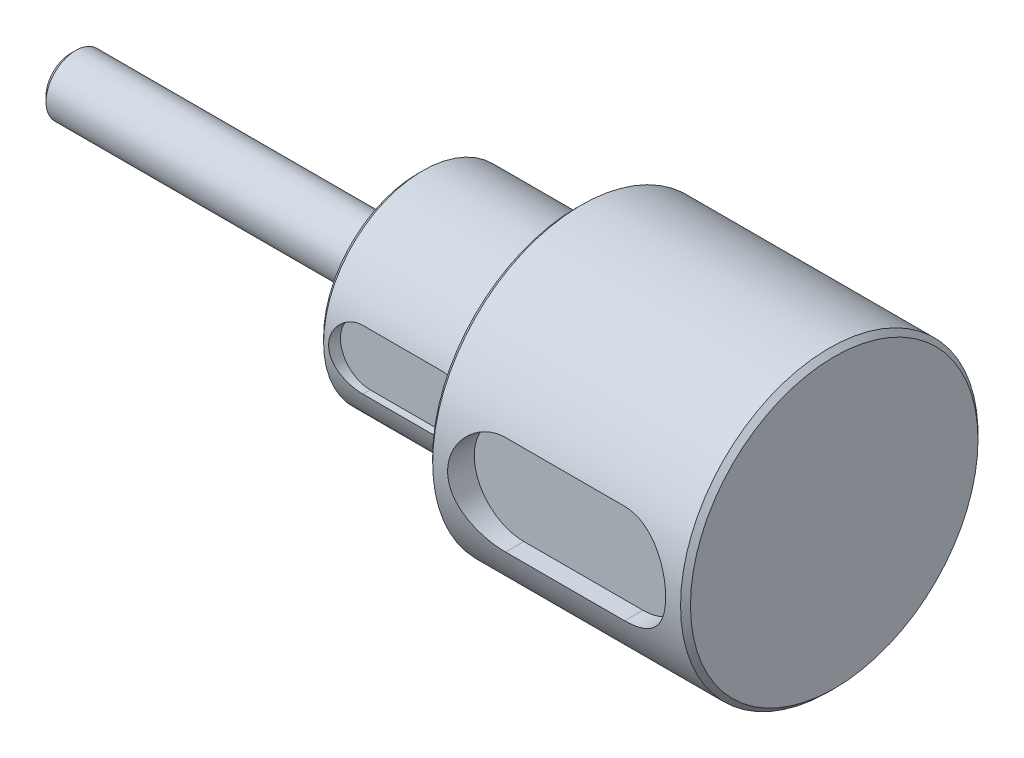
ISO-10303-21;
HEADER;
FILE_DESCRIPTION(('STEP AP214'),'2;1');
FILE_NAME('part.step','',(''),(''),'','','');
FILE_SCHEMA(('AUTOMOTIVE_DESIGN { 1 0 10303 214 1 1 1 1 }'));
ENDSEC;
DATA;
#1=APPLICATION_CONTEXT('core data for automotive mechanical design processes');
#2=APPLICATION_PROTOCOL_DEFINITION('international standard','automotive_design',2000,#1);
#3=PRODUCT_CONTEXT('',#1,'mechanical');
#4=PRODUCT('Part','Part','',(#3));
#5=PRODUCT_RELATED_PRODUCT_CATEGORY('part','',(#4));
#6=PRODUCT_DEFINITION_FORMATION('','',#4);
#7=PRODUCT_DEFINITION_CONTEXT('part definition',#1,'design');
#8=PRODUCT_DEFINITION('design','',#6,#7);
#9=PRODUCT_DEFINITION_SHAPE('','',#8);
#10=(LENGTH_UNIT() NAMED_UNIT(*) SI_UNIT(.MILLI.,.METRE.));
#11=(NAMED_UNIT(*) PLANE_ANGLE_UNIT() SI_UNIT($,.RADIAN.));
#12=(NAMED_UNIT(*) SI_UNIT($,.STERADIAN.) SOLID_ANGLE_UNIT());
#13=UNCERTAINTY_MEASURE_WITH_UNIT(LENGTH_MEASURE(1.E-05),#10,'distance_accuracy_value','');
#14=(GEOMETRIC_REPRESENTATION_CONTEXT(3) GLOBAL_UNCERTAINTY_ASSIGNED_CONTEXT((#13)) GLOBAL_UNIT_ASSIGNED_CONTEXT((#10,
#11,#12)) REPRESENTATION_CONTEXT('',''));
#15=CARTESIAN_POINT('',(0.,0.,0.));
#16=DIRECTION('',(0.,0.,1.));
#17=DIRECTION('',(1.,0.,0.));
#18=AXIS2_PLACEMENT_3D('',#15,#16,#17);
#19=CARTESIAN_POINT('',(77.,0.,0.));
#20=DIRECTION('',(-1.,0.,0.));
#21=DIRECTION('',(0.,0.,1.));
#22=AXIS2_PLACEMENT_3D('',#19,#20,#21);
#23=PLANE('',#22);
#24=CARTESIAN_POINT('',(77.,0.,0.));
#25=DIRECTION('',(-1.,0.,0.));
#26=DIRECTION('',(0.,0.,1.));
#27=AXIS2_PLACEMENT_3D('',#24,#25,#26);
#28=CIRCLE('',#27,14.5);
#29=CARTESIAN_POINT('',(77.,0.,14.5));
#30=VERTEX_POINT('',#29);
#31=EDGE_CURVE('E184',#30,#30,#28,.T.);
#32=ORIENTED_EDGE('',*,*,#31,.F.);
#33=EDGE_LOOP('',(#32));
#34=FACE_BOUND('',#33,.T.);
#35=ADVANCED_FACE('F36',(#34),#23,.F.);
#36=CARTESIAN_POINT('',(77.,0.,0.));
#37=DIRECTION('',(-1.,0.,0.));
#38=DIRECTION('',(0.,0.,1.));
#39=AXIS2_PLACEMENT_3D('',#36,#37,#38);
#40=CONICAL_SURFACE('',#39,14.5,0.785398163397448);
#41=CARTESIAN_POINT('',(76.5,0.,0.));
#42=DIRECTION('',(-1.,0.,0.));
#43=DIRECTION('',(0.,0.,1.));
#44=AXIS2_PLACEMENT_3D('',#41,#42,#43);
#45=CIRCLE('',#44,15.);
#46=CARTESIAN_POINT('',(76.5,0.,15.));
#47=VERTEX_POINT('',#46);
#48=EDGE_CURVE('E181',#47,#47,#45,.T.);
#49=ORIENTED_EDGE('',*,*,#48,.F.);
#50=EDGE_LOOP('',(#49));
#51=FACE_BOUND('',#50,.T.);
#52=ORIENTED_EDGE('',*,*,#31,.T.);
#53=EDGE_LOOP('',(#52));
#54=FACE_BOUND('',#53,.T.);
#55=ADVANCED_FACE('F252',(#51,#54),#40,.T.);
#56=CARTESIAN_POINT('',(0.,0.,0.));
#57=DIRECTION('',(-1.,0.,0.));
#58=DIRECTION('',(0.,0.,1.));
#59=AXIS2_PLACEMENT_3D('',#56,#57,#58);
#60=CYLINDRICAL_SURFACE('',#59,15.);
#61=DIRECTION('',(-1.,0.,0.));
#62=VECTOR('',#61,1.);
#63=CARTESIAN_POINT('',(0.,5.,14.1421356237309));
#64=LINE('',#63,#62);
#65=CARTESIAN_POINT('',(70.,5.,14.142135623731));
#66=VERTEX_POINT('',#65);
#67=CARTESIAN_POINT('',(58.,5.,14.1421356237309));
#68=VERTEX_POINT('',#67);
#69=EDGE_CURVE('E11',#66,#68,#64,.T.);
#70=ORIENTED_EDGE('',*,*,#69,.F.);
#71=CARTESIAN_POINT('',(70.,5.,14.142135623731));
#72=CARTESIAN_POINT('',(70.1364118279069,5.00001928272081,14.1421132795953));
#73=CARTESIAN_POINT('',(70.272814985641,4.99441839460028,14.144108585197));
#74=CARTESIAN_POINT('',(70.5445632400942,4.97212026561631,14.1519707752355));
#75=CARTESIAN_POINT('',(70.6799086124535,4.95542602013328,14.1578366145644));
#76=CARTESIAN_POINT('',(70.948178657101,4.91115048442878,14.1732535212275));
#77=CARTESIAN_POINT('',(71.0811092969028,4.88360148534076,14.182793656248));
#78=CARTESIAN_POINT('',(71.3440246456575,4.81787909036063,14.2052544389481));
#79=CARTESIAN_POINT('',(71.474009247958,4.77970531049259,14.2181752088016));
#80=CARTESIAN_POINT('',(71.7300589983299,4.69309505128876,14.2469974292543));
#81=CARTESIAN_POINT('',(71.8561272198932,4.64466686529954,14.2628964699579));
#82=CARTESIAN_POINT('',(72.1036685479402,4.53792631398361,14.2972152683245));
#83=CARTESIAN_POINT('',(72.2251399191016,4.47961026060573,14.3156359660384));
#84=CARTESIAN_POINT('',(72.5815689284128,4.29042487291366,14.3739242294785));
#85=CARTESIAN_POINT('',(72.8086501836388,4.14528130436109,14.4168308914588));
#86=CARTESIAN_POINT('',(73.2436378703379,3.81524041281298,14.5077282855086));
#87=CARTESIAN_POINT('',(73.4505842489828,3.62912046165332,14.5558450324036));
#88=CARTESIAN_POINT('',(73.8310202405372,3.22494665570402,14.6506912904573));
#89=CARTESIAN_POINT('',(74.0045038958684,3.006887126647,14.6974205533429));
#90=CARTESIAN_POINT('',(74.317400334132,2.53801699448498,14.7856944680589));
#91=CARTESIAN_POINT('',(74.4558056562606,2.2865001167083,14.8270719634014));
#92=CARTESIAN_POINT('',(74.6879605244115,1.76214657981254,14.8984803449503));
#93=CARTESIAN_POINT('',(74.7817237118873,1.48931646315729,14.9285146967399));
#94=CARTESIAN_POINT('',(74.9186788208116,0.940146645163364,14.9729535792742));
#95=CARTESIAN_POINT('',(74.9635164270977,0.664259156539227,14.9878654569488));
#96=CARTESIAN_POINT('',(75.0065814283141,0.108494863035936,15.0021804126725));
#97=CARTESIAN_POINT('',(75.0048199293876,-0.171380975391811,15.0015871861129));
#98=CARTESIAN_POINT('',(74.9557786488014,-0.715519207983844,14.9853019394036));
#99=CARTESIAN_POINT('',(74.9102870031267,-0.979963426374041,14.9702030725849));
#100=CARTESIAN_POINT('',(74.7780338136946,-1.49722040864173,14.9273480020182));
#101=CARTESIAN_POINT('',(74.69126998155,-1.75003252671059,14.8995910964333));
#102=CARTESIAN_POINT('',(74.4778938687204,-2.24076278220401,14.8337834991293));
#103=CARTESIAN_POINT('',(74.3507724620934,-2.47844127676377,14.7956022127902));
#104=CARTESIAN_POINT('',(74.0606975546095,-2.92962419733441,14.7129190630403));
#105=CARTESIAN_POINT('',(73.8977343066694,-3.14312202351085,14.6684154814678));
#106=CARTESIAN_POINT('',(73.5316552598699,-3.55048180391261,14.5753148518701));
#107=CARTESIAN_POINT('',(73.3270123621527,-3.74294939170373,14.5266237190253));
#108=CARTESIAN_POINT('',(72.8877524582914,-4.09137879648192,14.4323697370697));
#109=CARTESIAN_POINT('',(72.6531258062456,-4.24732881968224,14.3868079019513));
#110=CARTESIAN_POINT('',(72.2816088120309,-4.45137197181612,14.3244699574743));
#111=CARTESIAN_POINT('',(72.1534307440413,-4.51477947987293,14.3045606178995));
#112=CARTESIAN_POINT('',(71.891793773804,-4.63050119526385,14.2675208843929));
#113=CARTESIAN_POINT('',(71.7583370974053,-4.68282002045479,14.2503893343581));
#114=CARTESIAN_POINT('',(71.4872286417921,-4.77584283639463,14.2194841629367));
#115=CARTESIAN_POINT('',(71.34958160862,-4.81655946314397,14.2057068907929));
#116=CARTESIAN_POINT('',(71.0710398069407,-4.88604801985988,14.1819560641116));
#117=CARTESIAN_POINT('',(70.9301465525477,-4.91482540411389,14.1719807728584));
#118=CARTESIAN_POINT('',(70.6579469418116,-4.9582745368723,14.1568366544479));
#119=CARTESIAN_POINT('',(70.5268131005268,-4.97391718926364,14.1513381564974));
#120=CARTESIAN_POINT('',(70.2637895841252,-4.99478118687353,14.143980412972));
#121=CARTESIAN_POINT('',(70.1319011054151,-5.00001597952916,14.1421164714419));
#122=CARTESIAN_POINT('',(70.,-5.,14.142135623731));
#123=B_SPLINE_CURVE_WITH_KNOTS('',3,(#71,#72,#73,#74,#75,#76,#77,#78,#79,#80,#81,#82,#83,#84,
#85,#86,#87,#88,#89,#90,#91,#92,#93,#94,#95,#96,#97,#98,#99,#100,#101,#102,#103,#104,#105,#106,
#107,#108,#109,#110,#111,#112,#113,#114,#115,#116,#117,#118,#119,#120,#121,#122),.UNSPECIFIED.,
.F.,.F.,(4,2,2,2,2,2,2,2,2,2,2,2,2,2,2,2,2,2,2,2,2,2,2,2,2,4),(0.,0.409092423677147,
0.818074430847312,1.22584885885813,1.63363802561077,2.04109864022585,2.44871156823776,
3.26359482908312,4.10724851154046,4.95105225659395,5.81687991006164,6.68244281946295,
7.51789679977672,8.35315166493869,9.15564418669333,9.95818120881897,10.771274204705,
11.584588592845,12.4361259663091,13.2879379758687,13.7206337000479,14.1531488734623,
14.5851911765746,15.0170358888757,15.4131122811713,15.8086765909866),.UNSPECIFIED.);
#124=CARTESIAN_POINT('',(70.,-5.,14.1421356237309));
#125=VERTEX_POINT('',#124);
#126=EDGE_CURVE('E273',#66,#125,#123,.T.);
#127=ORIENTED_EDGE('',*,*,#126,.T.);
#128=DIRECTION('',(-1.,0.,0.));
#129=VECTOR('',#128,1.);
#130=CARTESIAN_POINT('',(0.,-5.,14.1421356237309));
#131=LINE('',#130,#129);
#132=CARTESIAN_POINT('',(58.,-5.,14.1421356237309));
#133=VERTEX_POINT('',#132);
#134=EDGE_CURVE('E43',#125,#133,#131,.T.);
#135=ORIENTED_EDGE('',*,*,#134,.T.);
#136=CARTESIAN_POINT('',(58.,-5.,14.142135623731));
#137=CARTESIAN_POINT('',(57.8635881720931,-5.00001928272081,14.1421132795953));
#138=CARTESIAN_POINT('',(57.727185014359,-4.99441839460028,14.144108585197));
#139=CARTESIAN_POINT('',(57.4554367599058,-4.97212026561631,14.1519707752355));
#140=CARTESIAN_POINT('',(57.3200913875465,-4.95542602013328,14.1578366145644));
#141=CARTESIAN_POINT('',(57.051821342899,-4.91115048442878,14.1732535212275));
#142=CARTESIAN_POINT('',(56.9188907030971,-4.88360148534075,14.182793656248));
#143=CARTESIAN_POINT('',(56.6559753543424,-4.81787909036062,14.2052544389481));
#144=CARTESIAN_POINT('',(56.525990752042,-4.77970531049258,14.2181752088016));
#145=CARTESIAN_POINT('',(56.2699410016701,-4.69309505128876,14.2469974292543));
#146=CARTESIAN_POINT('',(56.1438727801068,-4.64466686529954,14.2628964699579));
#147=CARTESIAN_POINT('',(55.8963314520598,-4.53792631398361,14.2972152683245));
#148=CARTESIAN_POINT('',(55.7748600808984,-4.47961026060572,14.3156359660384));
#149=CARTESIAN_POINT('',(55.4184310715872,-4.29042487291366,14.3739242294785));
#150=CARTESIAN_POINT('',(55.1913498163612,-4.14528130436108,14.4168308914588));
#151=CARTESIAN_POINT('',(54.7563621296621,-3.81524041281298,14.5077282855086));
#152=CARTESIAN_POINT('',(54.5494157510172,-3.62912046165332,14.5558450324036));
#153=CARTESIAN_POINT('',(54.1689797594628,-3.22494665570402,14.6506912904573));
#154=CARTESIAN_POINT('',(53.9954961041316,-3.006887126647,14.6974205533429));
#155=CARTESIAN_POINT('',(53.6825996658679,-2.53801699448499,14.7856944680589));
#156=CARTESIAN_POINT('',(53.5441943437394,-2.28650011670831,14.8270719634014));
#157=CARTESIAN_POINT('',(53.3120394755885,-1.76214657981255,14.8984803449503));
#158=CARTESIAN_POINT('',(53.2182762881127,-1.4893164631573,14.9285146967399));
#159=CARTESIAN_POINT('',(53.0813211791884,-0.940146645163373,14.9729535792742));
#160=CARTESIAN_POINT('',(53.0364835729023,-0.664259156539235,14.9878654569488));
#161=CARTESIAN_POINT('',(52.9934185716859,-0.108494863035941,15.0021804126725));
#162=CARTESIAN_POINT('',(52.9951800706124,0.171380975391807,15.0015871861129));
#163=CARTESIAN_POINT('',(53.0442213511986,0.715519207983843,14.9853019394036));
#164=CARTESIAN_POINT('',(53.0897129968732,0.979963426374041,14.9702030725849));
#165=CARTESIAN_POINT('',(53.2219661863054,1.49722040864173,14.9273480020182));
#166=CARTESIAN_POINT('',(53.30873001845,1.75003252671059,14.8995910964333));
#167=CARTESIAN_POINT('',(53.5221061312796,2.24076278220401,14.8337834991293));
#168=CARTESIAN_POINT('',(53.6492275379065,2.47844127676376,14.7956022127902));
#169=CARTESIAN_POINT('',(53.9393024453905,2.9296241973344,14.7129190630403));
#170=CARTESIAN_POINT('',(54.1022656933305,3.14312202351085,14.6684154814678));
#171=CARTESIAN_POINT('',(54.4683447401301,3.55048180391261,14.5753148518701));
#172=CARTESIAN_POINT('',(54.6729876378473,3.74294939170373,14.5266237190253));
#173=CARTESIAN_POINT('',(55.1122475417086,4.09137879648192,14.4323697370697));
#174=CARTESIAN_POINT('',(55.3468741937544,4.24732881968224,14.3868079019513));
#175=CARTESIAN_POINT('',(55.718391187969,4.45137197181612,14.3244699574743));
#176=CARTESIAN_POINT('',(55.8465692559587,4.51477947987293,14.3045606178995));
#177=CARTESIAN_POINT('',(56.108206226196,4.63050119526384,14.2675208843929));
#178=CARTESIAN_POINT('',(56.2416629025947,4.68282002045478,14.2503893343581));
#179=CARTESIAN_POINT('',(56.5127713582079,4.77584283639463,14.2194841629367));
#180=CARTESIAN_POINT('',(56.65041839138,4.81655946314397,14.2057068907929));
#181=CARTESIAN_POINT('',(56.9289601930592,4.88604801985988,14.1819560641116));
#182=CARTESIAN_POINT('',(57.0698534474523,4.91482540411389,14.1719807728584));
#183=CARTESIAN_POINT('',(57.3420530581884,4.9582745368723,14.1568366544479));
#184=CARTESIAN_POINT('',(57.4731868994732,4.97391718926364,14.1513381564974));
#185=CARTESIAN_POINT('',(57.7362104158748,4.99478118687353,14.143980412972));
#186=CARTESIAN_POINT('',(57.8680988945849,5.00001597952916,14.1421164714419));
#187=CARTESIAN_POINT('',(58.,5.,14.142135623731));
#188=B_SPLINE_CURVE_WITH_KNOTS('',3,(#136,#137,#138,#139,#140,#141,#142,#143,#144,#145,#146,
#147,#148,#149,#150,#151,#152,#153,#154,#155,#156,#157,#158,#159,#160,#161,#162,#163,#164,#165,
#166,#167,#168,#169,#170,#171,#172,#173,#174,#175,#176,#177,#178,#179,#180,#181,#182,#183,#184,
#185,#186,#187),.UNSPECIFIED.,.F.,.F.,(4,2,2,2,2,2,2,2,2,2,2,2,2,2,2,2,2,2,2,2,2,2,2,2,2,4),(0.,
0.409092423677168,0.818074430847312,1.22584885885816,1.63363802561078,2.04109864022586,
2.44871156823777,3.26359482908313,4.10724851154045,4.95105225659394,5.81687991006163,
6.68244281946293,7.51789679977672,8.35315166493869,9.15564418669334,9.95818120881897,
10.771274204705,11.584588592845,12.4361259663091,13.2879379758687,13.7206337000479,
14.1531488734623,14.5851911765746,15.0170358888757,15.4131122811713,15.8086765909866),.UNSPECIFIED.);
#189=EDGE_CURVE('E50',#133,#68,#188,.T.);
#190=ORIENTED_EDGE('',*,*,#189,.T.);
#191=EDGE_LOOP('',(#70,#127,#135,#190));
#192=FACE_BOUND('',#191,.T.);
#193=CARTESIAN_POINT('',(51.5,0.,0.));
#194=DIRECTION('',(-1.,0.,0.));
#195=DIRECTION('',(0.,0.,1.));
#196=AXIS2_PLACEMENT_3D('',#193,#194,#195);
#197=CIRCLE('',#196,15.);
#198=CARTESIAN_POINT('',(51.5,0.,15.));
#199=VERTEX_POINT('',#198);
#200=EDGE_CURVE('E178',#199,#199,#197,.T.);
#201=ORIENTED_EDGE('',*,*,#200,.F.);
#202=EDGE_LOOP('',(#201));
#203=FACE_BOUND('',#202,.T.);
#204=ORIENTED_EDGE('',*,*,#48,.T.);
#205=EDGE_LOOP('',(#204));
#206=FACE_BOUND('',#205,.T.);
#207=ADVANCED_FACE('F257',(#192,#203,#206),#60,.T.);
#208=CARTESIAN_POINT('',(51.5,0.,0.));
#209=DIRECTION('',(1.,0.,0.));
#210=DIRECTION('',(0.,0.,-1.));
#211=AXIS2_PLACEMENT_3D('',#208,#209,#210);
#212=CONICAL_SURFACE('',#211,15.,0.785398163397448);
#213=CARTESIAN_POINT('',(51.,0.,0.));
#214=DIRECTION('',(-1.,0.,0.));
#215=DIRECTION('',(0.,0.,1.));
#216=AXIS2_PLACEMENT_3D('',#213,#214,#215);
#217=CIRCLE('',#216,14.5);
#218=CARTESIAN_POINT('',(51.,0.,14.5));
#219=VERTEX_POINT('',#218);
#220=EDGE_CURVE('E175',#219,#219,#217,.T.);
#221=ORIENTED_EDGE('',*,*,#220,.F.);
#222=EDGE_LOOP('',(#221));
#223=FACE_BOUND('',#222,.T.);
#224=ORIENTED_EDGE('',*,*,#200,.T.);
#225=EDGE_LOOP('',(#224));
#226=FACE_BOUND('',#225,.T.);
#227=ADVANCED_FACE('F264',(#223,#226),#212,.T.);
#228=CARTESIAN_POINT('',(51.,10.5,0.));
#229=DIRECTION('',(1.,0.,0.));
#230=DIRECTION('',(0.,0.,-1.));
#231=AXIS2_PLACEMENT_3D('',#228,#229,#230);
#232=PLANE('',#231);
#233=CARTESIAN_POINT('',(51.,0.,0.));
#234=DIRECTION('',(-1.,0.,0.));
#235=DIRECTION('',(0.,0.,1.));
#236=AXIS2_PLACEMENT_3D('',#233,#234,#235);
#237=CIRCLE('',#236,10.5);
#238=CARTESIAN_POINT('',(51.,0.,10.5));
#239=VERTEX_POINT('',#238);
#240=EDGE_CURVE('E172',#239,#239,#237,.T.);
#241=ORIENTED_EDGE('',*,*,#240,.F.);
#242=EDGE_LOOP('',(#241));
#243=FACE_BOUND('',#242,.T.);
#244=ORIENTED_EDGE('',*,*,#220,.T.);
#245=EDGE_LOOP('',(#244));
#246=FACE_BOUND('',#245,.T.);
#247=ADVANCED_FACE('F426',(#243,#246),#232,.F.);
#248=CARTESIAN_POINT('',(50.5,0.,0.));
#249=DIRECTION('',(-1.,0.,0.));
#250=DIRECTION('',(0.,0.,1.));
#251=AXIS2_PLACEMENT_3D('',#248,#249,#250);
#252=TOROIDAL_SURFACE('',#251,10.5,0.5);
#253=CARTESIAN_POINT('',(50.5,0.,0.));
#254=DIRECTION('',(-1.,0.,0.));
#255=DIRECTION('',(0.,0.,1.));
#256=AXIS2_PLACEMENT_3D('',#253,#254,#255);
#257=CIRCLE('',#256,10.);
#258=CARTESIAN_POINT('',(50.5,0.,10.));
#259=VERTEX_POINT('',#258);
#260=EDGE_CURVE('E169',#259,#259,#257,.T.);
#261=ORIENTED_EDGE('',*,*,#260,.F.);
#262=EDGE_LOOP('',(#261));
#263=FACE_BOUND('',#262,.T.);
#264=ORIENTED_EDGE('',*,*,#240,.T.);
#265=EDGE_LOOP('',(#264));
#266=FACE_BOUND('',#265,.T.);
#267=ADVANCED_FACE('F247',(#263,#266),#252,.F.);
#268=CARTESIAN_POINT('',(0.,0.,0.));
#269=DIRECTION('',(-1.,0.,0.));
#270=DIRECTION('',(0.,0.,1.));
#271=AXIS2_PLACEMENT_3D('',#268,#269,#270);
#272=CYLINDRICAL_SURFACE('',#271,10.);
#273=DIRECTION('',(-1.,0.,0.));
#274=VECTOR('',#273,1.);
#275=CARTESIAN_POINT('',(0.,3.,9.53939201416946));
#276=LINE('',#275,#274);
#277=CARTESIAN_POINT('',(47.,3.,9.53939201416946));
#278=VERTEX_POINT('',#277);
#279=CARTESIAN_POINT('',(39.,3.,9.53939201416946));
#280=VERTEX_POINT('',#279);
#281=EDGE_CURVE('E303',#278,#280,#276,.T.);
#282=ORIENTED_EDGE('',*,*,#281,.F.);
#283=CARTESIAN_POINT('',(47.,3.,9.53939201416946));
#284=CARTESIAN_POINT('',(47.0823355208227,3.00001027845728,9.53938054248206));
#285=CARTESIAN_POINT('',(47.1646644550632,2.99661062684472,9.54045772064378));
#286=CARTESIAN_POINT('',(47.3286939527655,2.98307142899347,9.54470412105986));
#287=CARTESIAN_POINT('',(47.4103946533244,2.97293339805418,9.54787287296849));
#288=CARTESIAN_POINT('',(47.5723849156732,2.94603140625045,9.55620668351003));
#289=CARTESIAN_POINT('',(47.652677524043,2.92928426957737,9.56136667250114));
#290=CARTESIAN_POINT('',(47.8114758441342,2.88932853030394,9.57351626651178));
#291=CARTESIAN_POINT('',(47.8899815090674,2.8661197587264,9.58050591937828));
#292=CARTESIAN_POINT('',(48.1219493879902,2.78708584446024,9.60391637654136));
#293=CARTESIAN_POINT('',(48.272068438833,2.72181852542972,9.62279007830391));
#294=CARTESIAN_POINT('',(48.5592260439791,2.56815043531275,9.66493213967819));
#295=CARTESIAN_POINT('',(48.6962584707622,2.47973889924159,9.68820254290641));
#296=CARTESIAN_POINT('',(48.9577229879478,2.27929879634442,9.73733650515374));
#297=CARTESIAN_POINT('',(49.0816848740609,2.16666914746584,9.76325505469874));
#298=CARTESIAN_POINT('',(49.3092736148388,1.92227736150433,9.81429628475077));
#299=CARTESIAN_POINT('',(49.412897033861,1.79051199848164,9.8394188301941));
#300=CARTESIAN_POINT('',(49.5989268650946,1.50821997465697,9.88666477976534));
#301=CARTESIAN_POINT('',(49.6808501797826,1.35736167401016,9.90871541546877));
#302=CARTESIAN_POINT('',(49.8179770040029,1.04324233568303,9.94668940088144));
#303=CARTESIAN_POINT('',(49.873187403368,0.879984508687983,9.96261433032403));
#304=CARTESIAN_POINT('',(49.953759551791,0.550649404820599,9.98615279768398));
#305=CARTESIAN_POINT('',(49.9799297035176,0.384786253016201,9.99399098526792));
#306=CARTESIAN_POINT('',(50.004234695146,0.0508471415689268,10.0012640407204));
#307=CARTESIAN_POINT('',(50.0023748426782,-0.11722839312534,10.0007004995012));
#308=CARTESIAN_POINT('',(49.9712141793086,-0.445143199271825,9.99139205125586));
#309=CARTESIAN_POINT('',(49.9427893091919,-0.605074290763029,9.98290831016512));
#310=CARTESIAN_POINT('',(49.8607367303745,-0.917780104370315,9.95903027401822));
#311=CARTESIAN_POINT('',(49.8071077013173,-1.07055445110879,9.94363561692558));
#312=CARTESIAN_POINT('',(49.6755755564753,-1.36669563173912,9.90730429851782));
#313=CARTESIAN_POINT('',(49.5973967112239,-1.50993201207613,9.88630511384915));
#314=CARTESIAN_POINT('',(49.4192028199656,-1.781531059161,9.84099249303646));
#315=CARTESIAN_POINT('',(49.3191828810593,-1.90989038323251,9.81667831471806));
#316=CARTESIAN_POINT('',(49.0956160238154,-2.15330901082205,9.7662334714278));
#317=CARTESIAN_POINT('',(48.9713122724738,-2.26766702955975,9.74006890899097));
#318=CARTESIAN_POINT('',(48.7050051531489,-2.47413538985067,9.68968430229327));
#319=CARTESIAN_POINT('',(48.5629966392702,-2.5662392402618,9.66546482675134));
#320=CARTESIAN_POINT('',(48.2634381431001,-2.72632814481701,9.62154457591303));
#321=CARTESIAN_POINT('',(48.1057456408129,-2.79406012682263,9.60189192491895));
#322=CARTESIAN_POINT('',(47.7805509920369,-2.90171772009404,9.56991327306402));
#323=CARTESIAN_POINT('',(47.6130642785713,-2.94168586436072,9.55757606951749));
#324=CARTESIAN_POINT('',(47.3700102218596,-2.97802407180158,9.54628064650012));
#325=CARTESIAN_POINT('',(47.2962185316408,-2.98626405978017,9.54370312550533));
#326=CARTESIAN_POINT('',(47.148297041801,-2.99724711229708,9.54025857223564));
#327=CARTESIAN_POINT('',(47.0741679006723,-2.99999825936538,9.53938902493288));
#328=CARTESIAN_POINT('',(47.,-3.,9.53939201416946));
#329=B_SPLINE_CURVE_WITH_KNOTS('',3,(#283,#284,#285,#286,#287,#288,#289,#290,#291,#292,#293,
#294,#295,#296,#297,#298,#299,#300,#301,#302,#303,#304,#305,#306,#307,#308,#309,#310,#311,#312,
#313,#314,#315,#316,#317,#318,#319,#320,#321,#322,#323,#324,#325,#326,#327,#328),.UNSPECIFIED.,
.F.,.F.,(4,2,2,2,2,2,2,2,2,2,2,2,2,2,2,2,2,2,2,2,2,2,4),(0.,0.246918142439474,0.493780777706094,
0.740019009623013,0.986263681482027,1.47813347402026,1.97023245590779,2.47635119822766,
2.98255536239032,3.4992281062007,4.01576751791672,4.51753600864764,5.019209488041,
5.50490358251093,5.99062312360831,6.48200583350621,6.9734987373917,7.48389234847122,
7.99443465298715,8.51013494368214,9.02504345105573,9.24774267716777,9.47011372732391),.UNSPECIFIED.);
#330=CARTESIAN_POINT('',(47.,-3.,9.53939201416946));
#331=VERTEX_POINT('',#330);
#332=EDGE_CURVE('E187',#278,#331,#329,.T.);
#333=ORIENTED_EDGE('',*,*,#332,.T.);
#334=DIRECTION('',(-1.,0.,0.));
#335=VECTOR('',#334,1.);
#336=CARTESIAN_POINT('',(0.,-3.,9.53939201416946));
#337=LINE('',#336,#335);
#338=CARTESIAN_POINT('',(39.,-3.,9.53939201416946));
#339=VERTEX_POINT('',#338);
#340=EDGE_CURVE('E299',#331,#339,#337,.T.);
#341=ORIENTED_EDGE('',*,*,#340,.T.);
#342=CARTESIAN_POINT('',(39.,-3.,9.53939201416946));
#343=CARTESIAN_POINT('',(38.9176644791773,-3.00001027845728,9.53938054248206));
#344=CARTESIAN_POINT('',(38.8353355449368,-2.99661062684472,9.54045772064378));
#345=CARTESIAN_POINT('',(38.6713060472345,-2.98307142899347,9.54470412105986));
#346=CARTESIAN_POINT('',(38.5896053466756,-2.97293339805418,9.54787287296849));
#347=CARTESIAN_POINT('',(38.4276150843268,-2.94603140625045,9.55620668351003));
#348=CARTESIAN_POINT('',(38.347322475957,-2.92928426957737,9.56136667250114));
#349=CARTESIAN_POINT('',(38.1885241558658,-2.88932853030394,9.57351626651178));
#350=CARTESIAN_POINT('',(38.1100184909326,-2.8661197587264,9.58050591937828));
#351=CARTESIAN_POINT('',(37.8780506120099,-2.78708584446024,9.60391637654136));
#352=CARTESIAN_POINT('',(37.727931561167,-2.72181852542972,9.62279007830391));
#353=CARTESIAN_POINT('',(37.440773956021,-2.56815043531275,9.66493213967819));
#354=CARTESIAN_POINT('',(37.3037415292378,-2.47973889924159,9.68820254290641));
#355=CARTESIAN_POINT('',(37.0422770120522,-2.27929879634442,9.73733650515374));
#356=CARTESIAN_POINT('',(36.9183151259391,-2.16666914746584,9.76325505469874));
#357=CARTESIAN_POINT('',(36.6907263851613,-1.92227736150433,9.81429628475077));
#358=CARTESIAN_POINT('',(36.587102966139,-1.79051199848164,9.8394188301941));
#359=CARTESIAN_POINT('',(36.4010731349055,-1.50821997465697,9.88666477976534));
#360=CARTESIAN_POINT('',(36.3191498202174,-1.35736167401016,9.90871541546877));
#361=CARTESIAN_POINT('',(36.1820229959971,-1.04324233568303,9.94668940088144));
#362=CARTESIAN_POINT('',(36.1268125966321,-0.879984508687984,9.96261433032403));
#363=CARTESIAN_POINT('',(36.046240448209,-0.550649404820599,9.98615279768398));
#364=CARTESIAN_POINT('',(36.0200702964824,-0.384786253016201,9.99399098526792));
#365=CARTESIAN_POINT('',(35.995765304854,-0.0508471415689264,10.0012640407204));
#366=CARTESIAN_POINT('',(35.9976251573218,0.11722839312534,10.0007004995012));
#367=CARTESIAN_POINT('',(36.0287858206914,0.445143199271825,9.99139205125586));
#368=CARTESIAN_POINT('',(36.0572106908081,0.605074290763029,9.98290831016512));
#369=CARTESIAN_POINT('',(36.1392632696255,0.917780104370315,9.95903027401822));
#370=CARTESIAN_POINT('',(36.1928922986827,1.07055445110879,9.94363561692558));
#371=CARTESIAN_POINT('',(36.3244244435248,1.36669563173912,9.90730429851782));
#372=CARTESIAN_POINT('',(36.4026032887761,1.50993201207613,9.88630511384915));
#373=CARTESIAN_POINT('',(36.5807971800344,1.781531059161,9.84099249303646));
#374=CARTESIAN_POINT('',(36.6808171189407,1.90989038323251,9.81667831471806));
#375=CARTESIAN_POINT('',(36.9043839761846,2.15330901082206,9.7662334714278));
#376=CARTESIAN_POINT('',(37.0286877275262,2.26766702955976,9.74006890899097));
#377=CARTESIAN_POINT('',(37.2949948468511,2.47413538985067,9.68968430229327));
#378=CARTESIAN_POINT('',(37.4370033607298,2.5662392402618,9.66546482675134));
#379=CARTESIAN_POINT('',(37.7365618568999,2.72632814481701,9.62154457591303));
#380=CARTESIAN_POINT('',(37.8942543591871,2.79406012682262,9.60189192491895));
#381=CARTESIAN_POINT('',(38.2194490079632,2.90171772009404,9.56991327306402));
#382=CARTESIAN_POINT('',(38.3869357214287,2.94168586436072,9.55757606951749));
#383=CARTESIAN_POINT('',(38.6299897781404,2.97802407180159,9.54628064650012));
#384=CARTESIAN_POINT('',(38.7037814683592,2.98626405978017,9.54370312550533));
#385=CARTESIAN_POINT('',(38.851702958199,2.99724711229708,9.54025857223564));
#386=CARTESIAN_POINT('',(38.9258320993277,2.99999825936538,9.53938902493288));
#387=CARTESIAN_POINT('',(39.,3.,9.53939201416946));
#388=B_SPLINE_CURVE_WITH_KNOTS('',3,(#342,#343,#344,#345,#346,#347,#348,#349,#350,#351,#352,
#353,#354,#355,#356,#357,#358,#359,#360,#361,#362,#363,#364,#365,#366,#367,#368,#369,#370,#371,
#372,#373,#374,#375,#376,#377,#378,#379,#380,#381,#382,#383,#384,#385,#386,#387),.UNSPECIFIED.,
.F.,.F.,(4,2,2,2,2,2,2,2,2,2,2,2,2,2,2,2,2,2,2,2,2,2,4),(0.,0.246918142439467,0.493780777706094,
0.740019009623013,0.986263681482027,1.47813347402026,1.97023245590779,2.47635119822766,
2.98255536239032,3.4992281062007,4.01576751791672,4.51753600864764,5.01920948804101,
5.50490358251093,5.99062312360831,6.48200583350621,6.9734987373917,7.48389234847122,
7.99443465298715,8.51013494368213,9.02504345105574,9.24774267716778,9.47011372732391),.UNSPECIFIED.);
#389=EDGE_CURVE('E58',#339,#280,#388,.T.);
#390=ORIENTED_EDGE('',*,*,#389,.T.);
#391=EDGE_LOOP('',(#282,#333,#341,#390));
#392=FACE_BOUND('',#391,.T.);
#393=CARTESIAN_POINT('',(35.5,0.,0.));
#394=DIRECTION('',(-1.,0.,0.));
#395=DIRECTION('',(0.,0.,1.));
#396=AXIS2_PLACEMENT_3D('',#393,#394,#395);
#397=CIRCLE('',#396,10.);
#398=CARTESIAN_POINT('',(35.5,0.,10.));
#399=VERTEX_POINT('',#398);
#400=EDGE_CURVE('E166',#399,#399,#397,.T.);
#401=ORIENTED_EDGE('',*,*,#400,.F.);
#402=EDGE_LOOP('',(#401));
#403=FACE_BOUND('',#402,.T.);
#404=ORIENTED_EDGE('',*,*,#260,.T.);
#405=EDGE_LOOP('',(#404));
#406=FACE_BOUND('',#405,.T.);
#407=ADVANCED_FACE('F202',(#392,#403,#406),#272,.T.);
#408=CARTESIAN_POINT('',(35.5,0.,0.));
#409=DIRECTION('',(1.,0.,0.));
#410=DIRECTION('',(0.,0.,-1.));
#411=AXIS2_PLACEMENT_3D('',#408,#409,#410);
#412=CONICAL_SURFACE('',#411,10.,0.785398163397448);
#413=CARTESIAN_POINT('',(35.,0.,0.));
#414=DIRECTION('',(-1.,0.,0.));
#415=DIRECTION('',(0.,0.,1.));
#416=AXIS2_PLACEMENT_3D('',#413,#414,#415);
#417=CIRCLE('',#416,9.5);
#418=CARTESIAN_POINT('',(35.,0.,9.5));
#419=VERTEX_POINT('',#418);
#420=EDGE_CURVE('E163',#419,#419,#417,.T.);
#421=ORIENTED_EDGE('',*,*,#420,.F.);
#422=EDGE_LOOP('',(#421));
#423=FACE_BOUND('',#422,.T.);
#424=ORIENTED_EDGE('',*,*,#400,.T.);
#425=EDGE_LOOP('',(#424));
#426=FACE_BOUND('',#425,.T.);
#427=ADVANCED_FACE('F240',(#423,#426),#412,.T.);
#428=CARTESIAN_POINT('',(35.,3.5,0.));
#429=DIRECTION('',(1.,0.,0.));
#430=DIRECTION('',(0.,0.,-1.));
#431=AXIS2_PLACEMENT_3D('',#428,#429,#430);
#432=PLANE('',#431);
#433=CARTESIAN_POINT('',(35.,0.,0.));
#434=DIRECTION('',(-1.,0.,0.));
#435=DIRECTION('',(0.,0.,1.));
#436=AXIS2_PLACEMENT_3D('',#433,#434,#435);
#437=CIRCLE('',#436,3.5);
#438=CARTESIAN_POINT('',(35.,0.,3.5));
#439=VERTEX_POINT('',#438);
#440=EDGE_CURVE('E160',#439,#439,#437,.T.);
#441=ORIENTED_EDGE('',*,*,#440,.F.);
#442=EDGE_LOOP('',(#441));
#443=FACE_BOUND('',#442,.T.);
#444=ORIENTED_EDGE('',*,*,#420,.T.);
#445=EDGE_LOOP('',(#444));
#446=FACE_BOUND('',#445,.T.);
#447=ADVANCED_FACE('F237',(#443,#446),#432,.F.);
#448=CARTESIAN_POINT('',(34.5,0.,0.));
#449=DIRECTION('',(-1.,0.,0.));
#450=DIRECTION('',(0.,0.,1.));
#451=AXIS2_PLACEMENT_3D('',#448,#449,#450);
#452=TOROIDAL_SURFACE('',#451,3.5,0.5);
#453=CARTESIAN_POINT('',(34.5,0.,0.));
#454=DIRECTION('',(-1.,0.,0.));
#455=DIRECTION('',(0.,0.,1.));
#456=AXIS2_PLACEMENT_3D('',#453,#454,#455);
#457=CIRCLE('',#456,3.);
#458=CARTESIAN_POINT('',(34.5,0.,3.));
#459=VERTEX_POINT('',#458);
#460=EDGE_CURVE('E157',#459,#459,#457,.T.);
#461=ORIENTED_EDGE('',*,*,#460,.F.);
#462=EDGE_LOOP('',(#461));
#463=FACE_BOUND('',#462,.T.);
#464=ORIENTED_EDGE('',*,*,#440,.T.);
#465=EDGE_LOOP('',(#464));
#466=FACE_BOUND('',#465,.T.);
#467=ADVANCED_FACE('F233',(#463,#466),#452,.F.);
#468=CARTESIAN_POINT('',(0.,0.,0.));
#469=DIRECTION('',(-1.,0.,0.));
#470=DIRECTION('',(0.,0.,1.));
#471=AXIS2_PLACEMENT_3D('',#468,#469,#470);
#472=CYLINDRICAL_SURFACE('',#471,3.);
#473=CARTESIAN_POINT('',(0.5,0.,0.));
#474=DIRECTION('',(-1.,0.,0.));
#475=DIRECTION('',(0.,0.,1.));
#476=AXIS2_PLACEMENT_3D('',#473,#474,#475);
#477=CIRCLE('',#476,3.);
#478=CARTESIAN_POINT('',(0.5,0.,3.));
#479=VERTEX_POINT('',#478);
#480=EDGE_CURVE('E154',#479,#479,#477,.T.);
#481=ORIENTED_EDGE('',*,*,#480,.F.);
#482=EDGE_LOOP('',(#481));
#483=FACE_BOUND('',#482,.T.);
#484=ORIENTED_EDGE('',*,*,#460,.T.);
#485=EDGE_LOOP('',(#484));
#486=FACE_BOUND('',#485,.T.);
#487=ADVANCED_FACE('F229',(#483,#486),#472,.T.);
#488=CARTESIAN_POINT('',(0.5,0.,0.));
#489=DIRECTION('',(1.,0.,0.));
#490=DIRECTION('',(0.,0.,-1.));
#491=AXIS2_PLACEMENT_3D('',#488,#489,#490);
#492=CONICAL_SURFACE('',#491,3.,0.785398163397448);
#493=CARTESIAN_POINT('',(0.,0.,0.));
#494=DIRECTION('',(-1.,0.,0.));
#495=DIRECTION('',(0.,0.,1.));
#496=AXIS2_PLACEMENT_3D('',#493,#494,#495);
#497=CIRCLE('',#496,2.5);
#498=CARTESIAN_POINT('',(0.,0.,2.5));
#499=VERTEX_POINT('',#498);
#500=EDGE_CURVE('E144',#499,#499,#497,.T.);
#501=ORIENTED_EDGE('',*,*,#500,.F.);
#502=EDGE_LOOP('',(#501));
#503=FACE_BOUND('',#502,.T.);
#504=ORIENTED_EDGE('',*,*,#480,.T.);
#505=EDGE_LOOP('',(#504));
#506=FACE_BOUND('',#505,.T.);
#507=ADVANCED_FACE('F225',(#503,#506),#492,.T.);
#508=CARTESIAN_POINT('',(0.,0.,0.));
#509=DIRECTION('',(1.,0.,0.));
#510=DIRECTION('',(0.,0.,-1.));
#511=AXIS2_PLACEMENT_3D('',#508,#509,#510);
#512=PLANE('',#511);
#513=ORIENTED_EDGE('',*,*,#500,.T.);
#514=EDGE_LOOP('',(#513));
#515=FACE_BOUND('',#514,.T.);
#516=ADVANCED_FACE('F222',(#515),#512,.F.);
#517=CARTESIAN_POINT('',(39.,0.,8.8));
#518=DIRECTION('',(0.,0.,1.));
#519=DIRECTION('',(1.,0.,0.));
#520=AXIS2_PLACEMENT_3D('',#517,#518,#519);
#521=CYLINDRICAL_SURFACE('',#520,3.);
#522=DIRECTION('',(0.,0.,1.));
#523=VECTOR('',#522,1.);
#524=CARTESIAN_POINT('',(39.,-3.,8.8));
#525=LINE('',#524,#523);
#526=CARTESIAN_POINT('',(39.,-3.,8.8));
#527=VERTEX_POINT('',#526);
#528=EDGE_CURVE('E141',#527,#339,#525,.T.);
#529=ORIENTED_EDGE('',*,*,#528,.F.);
#530=CARTESIAN_POINT('',(39.,0.,8.8));
#531=DIRECTION('',(0.,0.,1.));
#532=DIRECTION('',(1.,0.,0.));
#533=AXIS2_PLACEMENT_3D('',#530,#531,#532);
#534=CIRCLE('',#533,3.);
#535=CARTESIAN_POINT('',(39.,3.,8.8));
#536=VERTEX_POINT('',#535);
#537=EDGE_CURVE('E126',#536,#527,#534,.T.);
#538=ORIENTED_EDGE('',*,*,#537,.F.);
#539=DIRECTION('',(0.,0.,1.));
#540=VECTOR('',#539,1.);
#541=CARTESIAN_POINT('',(39.,3.,8.8));
#542=LINE('',#541,#540);
#543=EDGE_CURVE('E142',#536,#280,#542,.T.);
#544=ORIENTED_EDGE('',*,*,#543,.T.);
#545=ORIENTED_EDGE('',*,*,#389,.F.);
#546=EDGE_LOOP('',(#529,#538,#544,#545));
#547=FACE_BOUND('',#546,.T.);
#548=ADVANCED_FACE('F218',(#547),#521,.F.);
#549=CARTESIAN_POINT('',(39.,3.,8.8));
#550=DIRECTION('',(0.,-1.,0.));
#551=DIRECTION('',(0.,0.,-1.));
#552=AXIS2_PLACEMENT_3D('',#549,#550,#551);
#553=PLANE('',#552);
#554=ORIENTED_EDGE('',*,*,#281,.T.);
#555=ORIENTED_EDGE('',*,*,#543,.F.);
#556=DIRECTION('',(1.,0.,0.));
#557=VECTOR('',#556,1.);
#558=CARTESIAN_POINT('',(39.,3.,8.8));
#559=LINE('',#558,#557);
#560=CARTESIAN_POINT('',(47.,3.,8.8));
#561=VERTEX_POINT('',#560);
#562=EDGE_CURVE('E139',#536,#561,#559,.T.);
#563=ORIENTED_EDGE('',*,*,#562,.T.);
#564=DIRECTION('',(0.,0.,1.));
#565=VECTOR('',#564,1.);
#566=CARTESIAN_POINT('',(47.,3.,8.8));
#567=LINE('',#566,#565);
#568=EDGE_CURVE('E145',#561,#278,#567,.T.);
#569=ORIENTED_EDGE('',*,*,#568,.T.);
#570=EDGE_LOOP('',(#554,#555,#563,#569));
#571=FACE_BOUND('',#570,.T.);
#572=ADVANCED_FACE('F212',(#571),#553,.T.);
#573=CARTESIAN_POINT('',(47.,0.,8.8));
#574=DIRECTION('',(0.,0.,1.));
#575=DIRECTION('',(1.,0.,0.));
#576=AXIS2_PLACEMENT_3D('',#573,#574,#575);
#577=CYLINDRICAL_SURFACE('',#576,3.);
#578=ORIENTED_EDGE('',*,*,#568,.F.);
#579=CARTESIAN_POINT('',(47.,0.,8.8));
#580=DIRECTION('',(0.,0.,1.));
#581=DIRECTION('',(1.,0.,0.));
#582=AXIS2_PLACEMENT_3D('',#579,#580,#581);
#583=CIRCLE('',#582,3.);
#584=CARTESIAN_POINT('',(47.,-3.,8.8));
#585=VERTEX_POINT('',#584);
#586=EDGE_CURVE('E136',#585,#561,#583,.T.);
#587=ORIENTED_EDGE('',*,*,#586,.F.);
#588=DIRECTION('',(0.,0.,1.));
#589=VECTOR('',#588,1.);
#590=CARTESIAN_POINT('',(47.,-3.,8.8));
#591=LINE('',#590,#589);
#592=EDGE_CURVE('E148',#585,#331,#591,.T.);
#593=ORIENTED_EDGE('',*,*,#592,.T.);
#594=ORIENTED_EDGE('',*,*,#332,.F.);
#595=EDGE_LOOP('',(#578,#587,#593,#594));
#596=FACE_BOUND('',#595,.T.);
#597=ADVANCED_FACE('F206',(#596),#577,.F.);
#598=CARTESIAN_POINT('',(39.,-3.,8.8));
#599=DIRECTION('',(0.,-1.,0.));
#600=DIRECTION('',(0.,0.,-1.));
#601=AXIS2_PLACEMENT_3D('',#598,#599,#600);
#602=PLANE('',#601);
#603=ORIENTED_EDGE('',*,*,#592,.F.);
#604=DIRECTION('',(1.,0.,0.));
#605=VECTOR('',#604,1.);
#606=CARTESIAN_POINT('',(39.,-3.,8.8));
#607=LINE('',#606,#605);
#608=EDGE_CURVE('E133',#527,#585,#607,.T.);
#609=ORIENTED_EDGE('',*,*,#608,.F.);
#610=ORIENTED_EDGE('',*,*,#528,.T.);
#611=ORIENTED_EDGE('',*,*,#340,.F.);
#612=EDGE_LOOP('',(#603,#609,#610,#611));
#613=FACE_BOUND('',#612,.T.);
#614=ADVANCED_FACE('F211',(#613),#602,.F.);
#615=CARTESIAN_POINT('',(39.,0.,8.8));
#616=DIRECTION('',(0.,0.,1.));
#617=DIRECTION('',(1.,0.,0.));
#618=AXIS2_PLACEMENT_3D('',#615,#616,#617);
#619=PLANE('',#618);
#620=ORIENTED_EDGE('',*,*,#537,.T.);
#621=ORIENTED_EDGE('',*,*,#608,.T.);
#622=ORIENTED_EDGE('',*,*,#586,.T.);
#623=ORIENTED_EDGE('',*,*,#562,.F.);
#624=EDGE_LOOP('',(#620,#621,#622,#623));
#625=FACE_BOUND('',#624,.T.);
#626=ADVANCED_FACE('F216',(#625),#619,.T.);
#627=CARTESIAN_POINT('',(58.,0.,12.3));
#628=DIRECTION('',(0.,0.,1.));
#629=DIRECTION('',(1.,0.,0.));
#630=AXIS2_PLACEMENT_3D('',#627,#628,#629);
#631=CYLINDRICAL_SURFACE('',#630,5.);
#632=DIRECTION('',(0.,0.,1.));
#633=VECTOR('',#632,1.);
#634=CARTESIAN_POINT('',(58.,-5.,12.3));
#635=LINE('',#634,#633);
#636=CARTESIAN_POINT('',(58.,-5.,12.3));
#637=VERTEX_POINT('',#636);
#638=EDGE_CURVE('E99',#637,#133,#635,.T.);
#639=ORIENTED_EDGE('',*,*,#638,.F.);
#640=CARTESIAN_POINT('',(58.,0.,12.3));
#641=DIRECTION('',(0.,0.,1.));
#642=DIRECTION('',(1.,0.,0.));
#643=AXIS2_PLACEMENT_3D('',#640,#641,#642);
#644=CIRCLE('',#643,5.);
#645=CARTESIAN_POINT('',(58.,5.,12.3));
#646=VERTEX_POINT('',#645);
#647=EDGE_CURVE('E103',#646,#637,#644,.T.);
#648=ORIENTED_EDGE('',*,*,#647,.F.);
#649=DIRECTION('',(0.,0.,1.));
#650=VECTOR('',#649,1.);
#651=CARTESIAN_POINT('',(58.,5.,12.3));
#652=LINE('',#651,#650);
#653=EDGE_CURVE('E124',#646,#68,#652,.T.);
#654=ORIENTED_EDGE('',*,*,#653,.T.);
#655=ORIENTED_EDGE('',*,*,#189,.F.);
#656=EDGE_LOOP('',(#639,#648,#654,#655));
#657=FACE_BOUND('',#656,.T.);
#658=ADVANCED_FACE('F101',(#657),#631,.F.);
#659=CARTESIAN_POINT('',(58.,5.,12.3));
#660=DIRECTION('',(0.,-1.,0.));
#661=DIRECTION('',(0.,0.,-1.));
#662=AXIS2_PLACEMENT_3D('',#659,#660,#661);
#663=PLANE('',#662);
#664=ORIENTED_EDGE('',*,*,#69,.T.);
#665=ORIENTED_EDGE('',*,*,#653,.F.);
#666=DIRECTION('',(1.,0.,0.));
#667=VECTOR('',#666,1.);
#668=CARTESIAN_POINT('',(58.,5.,12.3));
#669=LINE('',#668,#667);
#670=CARTESIAN_POINT('',(70.,5.,12.3));
#671=VERTEX_POINT('',#670);
#672=EDGE_CURVE('E107',#646,#671,#669,.T.);
#673=ORIENTED_EDGE('',*,*,#672,.T.);
#674=DIRECTION('',(0.,0.,1.));
#675=VECTOR('',#674,1.);
#676=CARTESIAN_POINT('',(70.,5.,12.3));
#677=LINE('',#676,#675);
#678=EDGE_CURVE('E127',#671,#66,#677,.T.);
#679=ORIENTED_EDGE('',*,*,#678,.T.);
#680=EDGE_LOOP('',(#664,#665,#673,#679));
#681=FACE_BOUND('',#680,.T.);
#682=ADVANCED_FACE('F289',(#681),#663,.T.);
#683=CARTESIAN_POINT('',(70.,0.,12.3));
#684=DIRECTION('',(0.,0.,1.));
#685=DIRECTION('',(1.,0.,0.));
#686=AXIS2_PLACEMENT_3D('',#683,#684,#685);
#687=CYLINDRICAL_SURFACE('',#686,5.);
#688=ORIENTED_EDGE('',*,*,#678,.F.);
#689=CARTESIAN_POINT('',(70.,0.,12.3));
#690=DIRECTION('',(0.,0.,1.));
#691=DIRECTION('',(1.,0.,0.));
#692=AXIS2_PLACEMENT_3D('',#689,#690,#691);
#693=CIRCLE('',#692,5.);
#694=CARTESIAN_POINT('',(70.,-5.,12.3));
#695=VERTEX_POINT('',#694);
#696=EDGE_CURVE('E116',#695,#671,#693,.T.);
#697=ORIENTED_EDGE('',*,*,#696,.F.);
#698=DIRECTION('',(0.,0.,1.));
#699=VECTOR('',#698,1.);
#700=CARTESIAN_POINT('',(70.,-5.,12.3));
#701=LINE('',#700,#699);
#702=EDGE_CURVE('E106',#695,#125,#701,.T.);
#703=ORIENTED_EDGE('',*,*,#702,.T.);
#704=ORIENTED_EDGE('',*,*,#126,.F.);
#705=EDGE_LOOP('',(#688,#697,#703,#704));
#706=FACE_BOUND('',#705,.T.);
#707=ADVANCED_FACE('F310',(#706),#687,.F.);
#708=CARTESIAN_POINT('',(58.,-5.,12.3));
#709=DIRECTION('',(0.,-1.,0.));
#710=DIRECTION('',(0.,0.,-1.));
#711=AXIS2_PLACEMENT_3D('',#708,#709,#710);
#712=PLANE('',#711);
#713=ORIENTED_EDGE('',*,*,#702,.F.);
#714=DIRECTION('',(1.,0.,0.));
#715=VECTOR('',#714,1.);
#716=CARTESIAN_POINT('',(58.,-5.,12.3));
#717=LINE('',#716,#715);
#718=EDGE_CURVE('E110',#637,#695,#717,.T.);
#719=ORIENTED_EDGE('',*,*,#718,.F.);
#720=ORIENTED_EDGE('',*,*,#638,.T.);
#721=ORIENTED_EDGE('',*,*,#134,.F.);
#722=EDGE_LOOP('',(#713,#719,#720,#721));
#723=FACE_BOUND('',#722,.T.);
#724=ADVANCED_FACE('F111',(#723),#712,.F.);
#725=CARTESIAN_POINT('',(58.,0.,12.3));
#726=DIRECTION('',(0.,0.,1.));
#727=DIRECTION('',(1.,0.,0.));
#728=AXIS2_PLACEMENT_3D('',#725,#726,#727);
#729=PLANE('',#728);
#730=ORIENTED_EDGE('',*,*,#647,.T.);
#731=ORIENTED_EDGE('',*,*,#718,.T.);
#732=ORIENTED_EDGE('',*,*,#696,.T.);
#733=ORIENTED_EDGE('',*,*,#672,.F.);
#734=EDGE_LOOP('',(#730,#731,#732,#733));
#735=FACE_BOUND('',#734,.T.);
#736=ADVANCED_FACE('F119',(#735),#729,.T.);
#737=CLOSED_SHELL('',(#35,#55,#207,#227,#247,#267,#407,#427,#447,#467,#487,#507,#516,#548,#572,
#597,#614,#626,#658,#682,#707,#724,#736));
#738=MANIFOLD_SOLID_BREP('B2',#737);
#739=ADVANCED_BREP_SHAPE_REPRESENTATION('',(#18,#738),#14);
#740=SHAPE_DEFINITION_REPRESENTATION(#9,#739);
ENDSEC;
END-ISO-10303-21;
